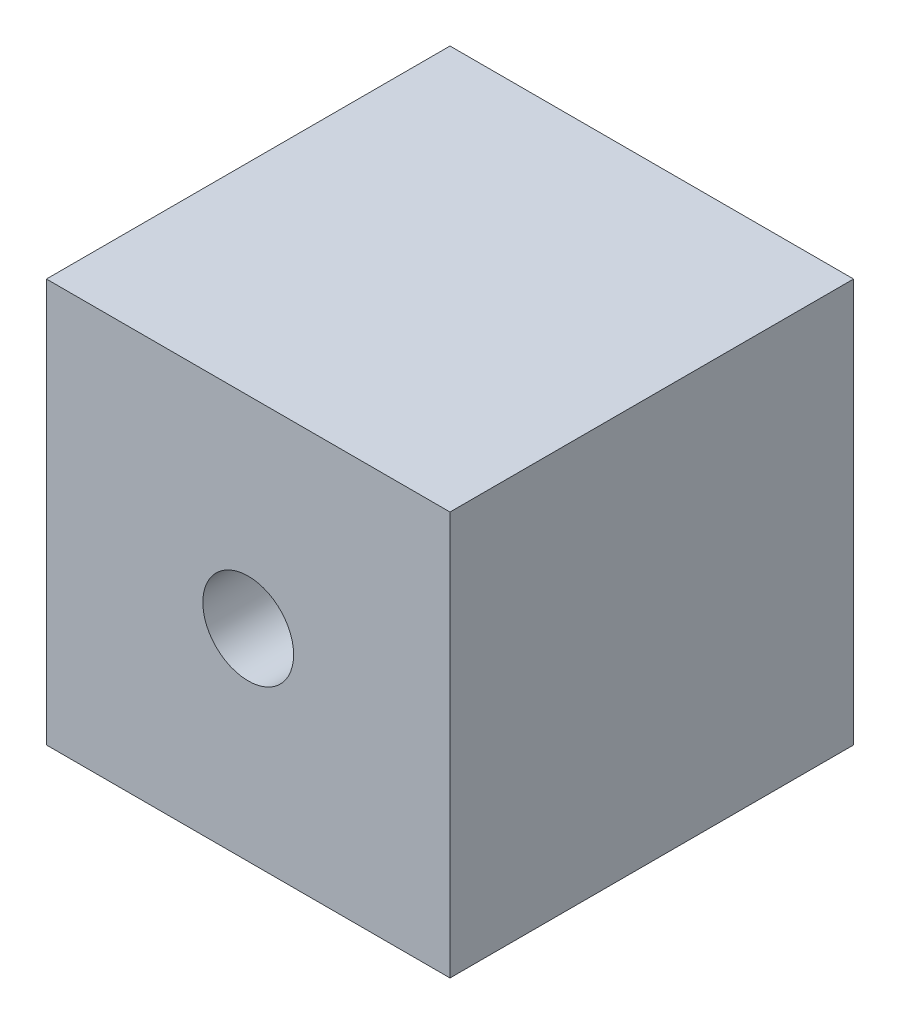
ISO-10303-21;
HEADER;
FILE_DESCRIPTION(('STEP AP214'),'2;1');
FILE_NAME('part.step','',(''),(''),'','','');
FILE_SCHEMA(('AUTOMOTIVE_DESIGN { 1 0 10303 214 1 1 1 1 }'));
ENDSEC;
DATA;
#1=APPLICATION_CONTEXT('core data for automotive mechanical design processes');
#2=APPLICATION_PROTOCOL_DEFINITION('international standard','automotive_design',2000,#1);
#3=PRODUCT_CONTEXT('',#1,'mechanical');
#4=PRODUCT('Part','Part','',(#3));
#5=PRODUCT_RELATED_PRODUCT_CATEGORY('part','',(#4));
#6=PRODUCT_DEFINITION_FORMATION('','',#4);
#7=PRODUCT_DEFINITION_CONTEXT('part definition',#1,'design');
#8=PRODUCT_DEFINITION('design','',#6,#7);
#9=PRODUCT_DEFINITION_SHAPE('','',#8);
#10=(LENGTH_UNIT() NAMED_UNIT(*) SI_UNIT(.MILLI.,.METRE.));
#11=(NAMED_UNIT(*) PLANE_ANGLE_UNIT() SI_UNIT($,.RADIAN.));
#12=(NAMED_UNIT(*) SI_UNIT($,.STERADIAN.) SOLID_ANGLE_UNIT());
#13=UNCERTAINTY_MEASURE_WITH_UNIT(LENGTH_MEASURE(1.E-05),#10,'distance_accuracy_value','');
#14=(GEOMETRIC_REPRESENTATION_CONTEXT(3) GLOBAL_UNCERTAINTY_ASSIGNED_CONTEXT((#13)) GLOBAL_UNIT_ASSIGNED_CONTEXT((#10,
#11,#12)) REPRESENTATION_CONTEXT('',''));
#15=CARTESIAN_POINT('',(0.,0.,0.));
#16=DIRECTION('',(0.,0.,1.));
#17=DIRECTION('',(1.,0.,0.));
#18=AXIS2_PLACEMENT_3D('',#15,#16,#17);
#19=CARTESIAN_POINT('',(-10392.3904035081,-4733.40551359016,146.));
#20=DIRECTION('',(0.,0.,1.));
#21=DIRECTION('',(1.,0.,0.));
#22=AXIS2_PLACEMENT_3D('',#19,#20,#21);
#23=PLANE('',#22);
#24=DIRECTION('',(1.,0.,0.));
#25=VECTOR('',#24,1.);
#26=CARTESIAN_POINT('',(-10392.3804035081,-4733.39551359016,146.));
#27=LINE('',#26,#25);
#28=CARTESIAN_POINT('',(-10392.3804035081,-4733.39551359016,146.));
#29=VERTEX_POINT('',#28);
#30=CARTESIAN_POINT('',(-10352.3804035081,-4733.39551359016,146.));
#31=VERTEX_POINT('',#30);
#32=EDGE_CURVE('E9',#29,#31,#27,.T.);
#33=ORIENTED_EDGE('',*,*,#32,.T.);
#34=DIRECTION('',(0.,1.,0.));
#35=VECTOR('',#34,1.);
#36=CARTESIAN_POINT('',(-10352.3804035081,-4733.39551359016,146.));
#37=LINE('',#36,#35);
#38=CARTESIAN_POINT('',(-10352.3804035081,-4693.39551359016,146.));
#39=VERTEX_POINT('',#38);
#40=EDGE_CURVE('E24',#31,#39,#37,.T.);
#41=ORIENTED_EDGE('',*,*,#40,.T.);
#42=DIRECTION('',(-1.,0.,0.));
#43=VECTOR('',#42,1.);
#44=CARTESIAN_POINT('',(-10392.3804035081,-4693.39551359016,146.));
#45=LINE('',#44,#43);
#46=CARTESIAN_POINT('',(-10392.3804035081,-4693.39551359016,146.));
#47=VERTEX_POINT('',#46);
#48=EDGE_CURVE('E77',#39,#47,#45,.T.);
#49=ORIENTED_EDGE('',*,*,#48,.T.);
#50=DIRECTION('',(0.,-1.,0.));
#51=VECTOR('',#50,1.);
#52=CARTESIAN_POINT('',(-10392.3804035081,-4733.39551359016,146.));
#53=LINE('',#52,#51);
#54=EDGE_CURVE('E87',#47,#29,#53,.T.);
#55=ORIENTED_EDGE('',*,*,#54,.T.);
#56=EDGE_LOOP('',(#33,#41,#49,#55));
#57=FACE_BOUND('',#56,.T.);
#58=CARTESIAN_POINT('',(-10372.3804035081,-4713.39551359016,146.));
#59=DIRECTION('',(0.,0.,1.));
#60=DIRECTION('',(1.,0.,0.));
#61=AXIS2_PLACEMENT_3D('',#58,#59,#60);
#62=CIRCLE('',#61,4.50000000000013);
#63=CARTESIAN_POINT('',(-10367.8804035081,-4713.39551359016,146.));
#64=VERTEX_POINT('',#63);
#65=EDGE_CURVE('E78',#64,#64,#62,.T.);
#66=ORIENTED_EDGE('',*,*,#65,.F.);
#67=EDGE_LOOP('',(#66));
#68=FACE_BOUND('',#67,.T.);
#69=ADVANCED_FACE('F15',(#57,#68),#23,.T.);
#70=CARTESIAN_POINT('',(-10392.3904035081,-4733.40551359016,106.));
#71=DIRECTION('',(0.,0.,-1.));
#72=DIRECTION('',(-1.,0.,0.));
#73=AXIS2_PLACEMENT_3D('',#70,#71,#72);
#74=PLANE('',#73);
#75=DIRECTION('',(1.,0.,0.));
#76=VECTOR('',#75,1.);
#77=CARTESIAN_POINT('',(-10392.3804035081,-4733.39551359016,106.));
#78=LINE('',#77,#76);
#79=CARTESIAN_POINT('',(-10392.3804035081,-4733.39551359016,106.));
#80=VERTEX_POINT('',#79);
#81=CARTESIAN_POINT('',(-10352.3804035081,-4733.39551359016,106.));
#82=VERTEX_POINT('',#81);
#83=EDGE_CURVE('E85',#80,#82,#78,.T.);
#84=ORIENTED_EDGE('',*,*,#83,.F.);
#85=DIRECTION('',(0.,-1.,0.));
#86=VECTOR('',#85,1.);
#87=CARTESIAN_POINT('',(-10392.3804035081,-4733.39551359016,106.));
#88=LINE('',#87,#86);
#89=CARTESIAN_POINT('',(-10392.3804035081,-4693.39551359016,106.));
#90=VERTEX_POINT('',#89);
#91=EDGE_CURVE('E69',#90,#80,#88,.T.);
#92=ORIENTED_EDGE('',*,*,#91,.F.);
#93=DIRECTION('',(-1.,0.,0.));
#94=VECTOR('',#93,1.);
#95=CARTESIAN_POINT('',(-10392.3804035081,-4693.39551359016,106.));
#96=LINE('',#95,#94);
#97=CARTESIAN_POINT('',(-10352.3804035081,-4693.39551359016,106.));
#98=VERTEX_POINT('',#97);
#99=EDGE_CURVE('E67',#98,#90,#96,.T.);
#100=ORIENTED_EDGE('',*,*,#99,.F.);
#101=DIRECTION('',(0.,1.,0.));
#102=VECTOR('',#101,1.);
#103=CARTESIAN_POINT('',(-10352.3804035081,-4733.39551359016,106.));
#104=LINE('',#103,#102);
#105=EDGE_CURVE('E54',#82,#98,#104,.T.);
#106=ORIENTED_EDGE('',*,*,#105,.F.);
#107=EDGE_LOOP('',(#84,#92,#100,#106));
#108=FACE_BOUND('',#107,.T.);
#109=ADVANCED_FACE('F68',(#108),#74,.T.);
#110=CARTESIAN_POINT('',(-10392.3904035081,-4733.39551359016,105.99));
#111=DIRECTION('',(0.,-1.,0.));
#112=DIRECTION('',(0.,0.,-1.));
#113=AXIS2_PLACEMENT_3D('',#110,#111,#112);
#114=PLANE('',#113);
#115=ORIENTED_EDGE('',*,*,#83,.T.);
#116=DIRECTION('',(0.,0.,-1.));
#117=VECTOR('',#116,1.);
#118=CARTESIAN_POINT('',(-10352.3804035081,-4733.39551359016,106.));
#119=LINE('',#118,#117);
#120=EDGE_CURVE('E60',#31,#82,#119,.T.);
#121=ORIENTED_EDGE('',*,*,#120,.F.);
#122=ORIENTED_EDGE('',*,*,#32,.F.);
#123=DIRECTION('',(0.,0.,1.));
#124=VECTOR('',#123,1.);
#125=CARTESIAN_POINT('',(-10392.3804035081,-4733.39551359016,146.));
#126=LINE('',#125,#124);
#127=EDGE_CURVE('E73',#80,#29,#126,.T.);
#128=ORIENTED_EDGE('',*,*,#127,.F.);
#129=EDGE_LOOP('',(#115,#121,#122,#128));
#130=FACE_BOUND('',#129,.T.);
#131=ADVANCED_FACE('F98',(#130),#114,.T.);
#132=CARTESIAN_POINT('',(-10392.3804035081,-4733.40551359016,146.01));
#133=DIRECTION('',(-1.,0.,0.));
#134=DIRECTION('',(0.,0.,1.));
#135=AXIS2_PLACEMENT_3D('',#132,#133,#134);
#136=PLANE('',#135);
#137=ORIENTED_EDGE('',*,*,#91,.T.);
#138=ORIENTED_EDGE('',*,*,#127,.T.);
#139=ORIENTED_EDGE('',*,*,#54,.F.);
#140=DIRECTION('',(0.,0.,1.));
#141=VECTOR('',#140,1.);
#142=CARTESIAN_POINT('',(-10392.3804035081,-4693.39551359016,146.));
#143=LINE('',#142,#141);
#144=EDGE_CURVE('E64',#90,#47,#143,.T.);
#145=ORIENTED_EDGE('',*,*,#144,.F.);
#146=EDGE_LOOP('',(#137,#138,#139,#145));
#147=FACE_BOUND('',#146,.T.);
#148=ADVANCED_FACE('F100',(#147),#136,.T.);
#149=CARTESIAN_POINT('',(-10392.3904035081,-4693.39551359016,146.01));
#150=DIRECTION('',(0.,1.,0.));
#151=DIRECTION('',(0.,0.,1.));
#152=AXIS2_PLACEMENT_3D('',#149,#150,#151);
#153=PLANE('',#152);
#154=ORIENTED_EDGE('',*,*,#99,.T.);
#155=ORIENTED_EDGE('',*,*,#144,.T.);
#156=ORIENTED_EDGE('',*,*,#48,.F.);
#157=DIRECTION('',(0.,0.,1.));
#158=VECTOR('',#157,1.);
#159=CARTESIAN_POINT('',(-10352.3804035081,-4693.39551359016,106.));
#160=LINE('',#159,#158);
#161=EDGE_CURVE('E58',#98,#39,#160,.T.);
#162=ORIENTED_EDGE('',*,*,#161,.F.);
#163=EDGE_LOOP('',(#154,#155,#156,#162));
#164=FACE_BOUND('',#163,.T.);
#165=ADVANCED_FACE('F75',(#164),#153,.T.);
#166=CARTESIAN_POINT('',(-10352.3804035081,-4733.40551359016,105.99));
#167=DIRECTION('',(1.,0.,0.));
#168=DIRECTION('',(0.,0.,-1.));
#169=AXIS2_PLACEMENT_3D('',#166,#167,#168);
#170=PLANE('',#169);
#171=ORIENTED_EDGE('',*,*,#105,.T.);
#172=ORIENTED_EDGE('',*,*,#161,.T.);
#173=ORIENTED_EDGE('',*,*,#40,.F.);
#174=ORIENTED_EDGE('',*,*,#120,.T.);
#175=EDGE_LOOP('',(#171,#172,#173,#174));
#176=FACE_BOUND('',#175,.T.);
#177=ADVANCED_FACE('F56',(#176),#170,.T.);
#178=CARTESIAN_POINT('',(-10372.3804035081,-4713.39551359016,121.));
#179=DIRECTION('',(0.,0.,1.));
#180=DIRECTION('',(1.,0.,0.));
#181=AXIS2_PLACEMENT_3D('',#178,#179,#180);
#182=CYLINDRICAL_SURFACE('',#181,4.50000000000013);
#183=ORIENTED_EDGE('',*,*,#65,.T.);
#184=EDGE_LOOP('',(#183));
#185=FACE_BOUND('',#184,.T.);
#186=CARTESIAN_POINT('',(-10372.3804035081,-4713.39551359016,116.));
#187=DIRECTION('',(0.,0.,1.));
#188=DIRECTION('',(1.,0.,0.));
#189=AXIS2_PLACEMENT_3D('',#186,#187,#188);
#190=CIRCLE('',#189,4.50000000000017);
#191=CARTESIAN_POINT('',(-10367.8804035081,-4713.39551359016,116.));
#192=VERTEX_POINT('',#191);
#193=EDGE_CURVE('E19',#192,#192,#190,.T.);
#194=ORIENTED_EDGE('',*,*,#193,.F.);
#195=EDGE_LOOP('',(#194));
#196=FACE_BOUND('',#195,.T.);
#197=ADVANCED_FACE('F17',(#185,#196),#182,.F.);
#198=CARTESIAN_POINT('',(-10372.3804035081,-4713.39551359016,116.));
#199=DIRECTION('',(0.,0.,1.));
#200=DIRECTION('',(1.,0.,0.));
#201=AXIS2_PLACEMENT_3D('',#198,#199,#200);
#202=CONICAL_SURFACE('',#201,4.50000000000017,1.02974425867667);
#203=CARTESIAN_POINT('',(-10372.3804035081,-4713.39551359016,113.296127214376));
#204=VERTEX_POINT('',#203);
#205=VERTEX_LOOP('',#204);
#206=FACE_BOUND('',#205,.T.);
#207=ORIENTED_EDGE('',*,*,#193,.T.);
#208=EDGE_LOOP('',(#207));
#209=FACE_BOUND('',#208,.T.);
#210=ADVANCED_FACE('F154',(#206,#209),#202,.F.);
#211=CLOSED_SHELL('',(#69,#109,#131,#148,#165,#177,#197,#210));
#212=MANIFOLD_SOLID_BREP('B1',#211);
#213=ADVANCED_BREP_SHAPE_REPRESENTATION('',(#18,#212),#14);
#214=SHAPE_DEFINITION_REPRESENTATION(#9,#213);
ENDSEC;
END-ISO-10303-21;
